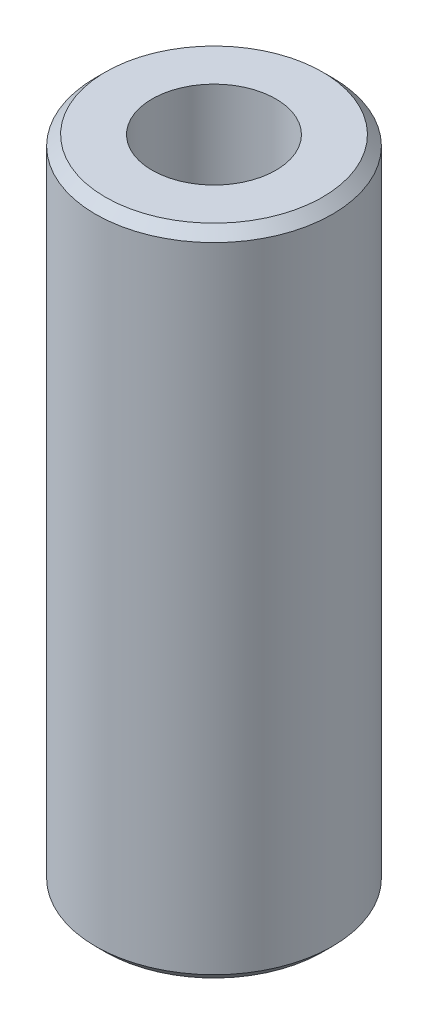
ISO-10303-21;
HEADER;
FILE_DESCRIPTION(('STEP AP214'),'2;1');
FILE_NAME('part.step','',(''),(''),'','','');
FILE_SCHEMA(('AUTOMOTIVE_DESIGN { 1 0 10303 214 1 1 1 1 }'));
ENDSEC;
DATA;
#1=APPLICATION_CONTEXT('core data for automotive mechanical design processes');
#2=APPLICATION_PROTOCOL_DEFINITION('international standard','automotive_design',2000,#1);
#3=PRODUCT_CONTEXT('',#1,'mechanical');
#4=PRODUCT('Part','Part','',(#3));
#5=PRODUCT_RELATED_PRODUCT_CATEGORY('part','',(#4));
#6=PRODUCT_DEFINITION_FORMATION('','',#4);
#7=PRODUCT_DEFINITION_CONTEXT('part definition',#1,'design');
#8=PRODUCT_DEFINITION('design','',#6,#7);
#9=PRODUCT_DEFINITION_SHAPE('','',#8);
#10=(LENGTH_UNIT() NAMED_UNIT(*) SI_UNIT(.MILLI.,.METRE.));
#11=(NAMED_UNIT(*) PLANE_ANGLE_UNIT() SI_UNIT($,.RADIAN.));
#12=(NAMED_UNIT(*) SI_UNIT($,.STERADIAN.) SOLID_ANGLE_UNIT());
#13=UNCERTAINTY_MEASURE_WITH_UNIT(LENGTH_MEASURE(1.E-05),#10,'distance_accuracy_value','');
#14=(GEOMETRIC_REPRESENTATION_CONTEXT(3) GLOBAL_UNCERTAINTY_ASSIGNED_CONTEXT((#13)) GLOBAL_UNIT_ASSIGNED_CONTEXT((#10,
#11,#12)) REPRESENTATION_CONTEXT('',''));
#15=CARTESIAN_POINT('',(0.,0.,0.));
#16=DIRECTION('',(0.,0.,1.));
#17=DIRECTION('',(1.,0.,0.));
#18=AXIS2_PLACEMENT_3D('',#15,#16,#17);
#19=CARTESIAN_POINT('',(0.,13.15085,0.));
#20=DIRECTION('',(0.,-1.,0.));
#21=DIRECTION('',(0.,0.,-1.));
#22=AXIS2_PLACEMENT_3D('',#19,#20,#21);
#23=CYLINDRICAL_SURFACE('',#22,4.7625);
#24=CARTESIAN_POINT('',(0.,-12.753975,0.));
#25=DIRECTION('',(0.,1.,0.));
#26=DIRECTION('',(0.,0.,1.));
#27=AXIS2_PLACEMENT_3D('',#24,#25,#26);
#28=CIRCLE('',#27,4.7625);
#29=CARTESIAN_POINT('',(0.,-12.753975,4.7625));
#30=VERTEX_POINT('',#29);
#31=EDGE_CURVE('E45',#30,#30,#28,.T.);
#32=ORIENTED_EDGE('',*,*,#31,.T.);
#33=EDGE_LOOP('',(#32));
#34=FACE_BOUND('',#33,.T.);
#35=CARTESIAN_POINT('',(0.,12.753975,0.));
#36=DIRECTION('',(0.,1.,0.));
#37=DIRECTION('',(0.,0.,1.));
#38=AXIS2_PLACEMENT_3D('',#35,#36,#37);
#39=CIRCLE('',#38,4.7625);
#40=CARTESIAN_POINT('',(0.,12.753975,4.7625));
#41=VERTEX_POINT('',#40);
#42=EDGE_CURVE('E49',#41,#41,#39,.F.);
#43=ORIENTED_EDGE('',*,*,#42,.T.);
#44=EDGE_LOOP('',(#43));
#45=FACE_BOUND('',#44,.T.);
#46=ADVANCED_FACE('F33',(#34,#45),#23,.T.);
#47=CARTESIAN_POINT('',(0.,13.15085,0.));
#48=DIRECTION('',(0.,1.,0.));
#49=DIRECTION('',(0.,0.,1.));
#50=AXIS2_PLACEMENT_3D('',#47,#48,#49);
#51=PLANE('',#50);
#52=CARTESIAN_POINT('',(0.,13.15085,0.));
#53=DIRECTION('',(0.,1.,0.));
#54=DIRECTION('',(0.,0.,1.));
#55=AXIS2_PLACEMENT_3D('',#52,#53,#54);
#56=CIRCLE('',#55,2.4892);
#57=CARTESIAN_POINT('',(0.,13.15085,2.4892));
#58=VERTEX_POINT('',#57);
#59=EDGE_CURVE('E57',#58,#58,#56,.T.);
#60=ORIENTED_EDGE('',*,*,#59,.F.);
#61=EDGE_LOOP('',(#60));
#62=FACE_BOUND('',#61,.T.);
#63=CARTESIAN_POINT('',(0.,13.15085,0.));
#64=DIRECTION('',(0.,1.,0.));
#65=DIRECTION('',(0.,0.,1.));
#66=AXIS2_PLACEMENT_3D('',#63,#64,#65);
#67=CIRCLE('',#66,4.365625);
#68=CARTESIAN_POINT('',(0.,13.15085,4.365625));
#69=VERTEX_POINT('',#68);
#70=EDGE_CURVE('E10',#69,#69,#67,.T.);
#71=ORIENTED_EDGE('',*,*,#70,.T.);
#72=EDGE_LOOP('',(#71));
#73=FACE_BOUND('',#72,.T.);
#74=ADVANCED_FACE('F63',(#62,#73),#51,.T.);
#75=CARTESIAN_POINT('',(0.,-13.15085,0.));
#76=DIRECTION('',(0.,1.,0.));
#77=DIRECTION('',(0.,0.,1.));
#78=AXIS2_PLACEMENT_3D('',#75,#76,#77);
#79=PLANE('',#78);
#80=CARTESIAN_POINT('',(0.,-13.15085,0.));
#81=DIRECTION('',(0.,1.,0.));
#82=DIRECTION('',(0.,0.,1.));
#83=AXIS2_PLACEMENT_3D('',#80,#81,#82);
#84=CIRCLE('',#83,2.4892);
#85=CARTESIAN_POINT('',(0.,-13.15085,2.4892));
#86=VERTEX_POINT('',#85);
#87=EDGE_CURVE('E54',#86,#86,#84,.T.);
#88=ORIENTED_EDGE('',*,*,#87,.T.);
#89=EDGE_LOOP('',(#88));
#90=FACE_BOUND('',#89,.T.);
#91=CARTESIAN_POINT('',(0.,-13.15085,0.));
#92=DIRECTION('',(0.,1.,0.));
#93=DIRECTION('',(0.,0.,1.));
#94=AXIS2_PLACEMENT_3D('',#91,#92,#93);
#95=CIRCLE('',#94,4.365625);
#96=CARTESIAN_POINT('',(0.,-13.15085,4.365625));
#97=VERTEX_POINT('',#96);
#98=EDGE_CURVE('E41',#97,#97,#95,.F.);
#99=ORIENTED_EDGE('',*,*,#98,.T.);
#100=EDGE_LOOP('',(#99));
#101=FACE_BOUND('',#100,.T.);
#102=ADVANCED_FACE('F65',(#90,#101),#79,.F.);
#103=CARTESIAN_POINT('',(0.,-12.753975,0.));
#104=DIRECTION('',(0.,1.,0.));
#105=DIRECTION('',(0.,0.,1.));
#106=AXIS2_PLACEMENT_3D('',#103,#104,#105);
#107=CONICAL_SURFACE('',#106,4.7625,0.785398163397449);
#108=ORIENTED_EDGE('',*,*,#98,.F.);
#109=EDGE_LOOP('',(#108));
#110=FACE_BOUND('',#109,.T.);
#111=ORIENTED_EDGE('',*,*,#31,.F.);
#112=EDGE_LOOP('',(#111));
#113=FACE_BOUND('',#112,.T.);
#114=ADVANCED_FACE('F71',(#110,#113),#107,.T.);
#115=CARTESIAN_POINT('',(0.,13.15085,0.));
#116=DIRECTION('',(0.,-1.,0.));
#117=DIRECTION('',(0.,0.,-1.));
#118=AXIS2_PLACEMENT_3D('',#115,#116,#117);
#119=CONICAL_SURFACE('',#118,4.365625,0.785398163397441);
#120=ORIENTED_EDGE('',*,*,#42,.F.);
#121=EDGE_LOOP('',(#120));
#122=FACE_BOUND('',#121,.T.);
#123=ORIENTED_EDGE('',*,*,#70,.F.);
#124=EDGE_LOOP('',(#123));
#125=FACE_BOUND('',#124,.T.);
#126=ADVANCED_FACE('F36',(#122,#125),#119,.T.);
#127=CARTESIAN_POINT('',(0.,-13.15085,0.));
#128=DIRECTION('',(0.,1.,0.));
#129=DIRECTION('',(0.,0.,1.));
#130=AXIS2_PLACEMENT_3D('',#127,#128,#129);
#131=CYLINDRICAL_SURFACE('',#130,2.4892);
#132=ORIENTED_EDGE('',*,*,#87,.F.);
#133=EDGE_LOOP('',(#132));
#134=FACE_BOUND('',#133,.T.);
#135=ORIENTED_EDGE('',*,*,#59,.T.);
#136=EDGE_LOOP('',(#135));
#137=FACE_BOUND('',#136,.T.);
#138=ADVANCED_FACE('F61',(#134,#137),#131,.F.);
#139=CLOSED_SHELL('',(#46,#74,#102,#114,#126,#138));
#140=MANIFOLD_SOLID_BREP('B2',#139);
#141=ADVANCED_BREP_SHAPE_REPRESENTATION('',(#18,#140),#14);
#142=SHAPE_DEFINITION_REPRESENTATION(#9,#141);
ENDSEC;
END-ISO-10303-21;
